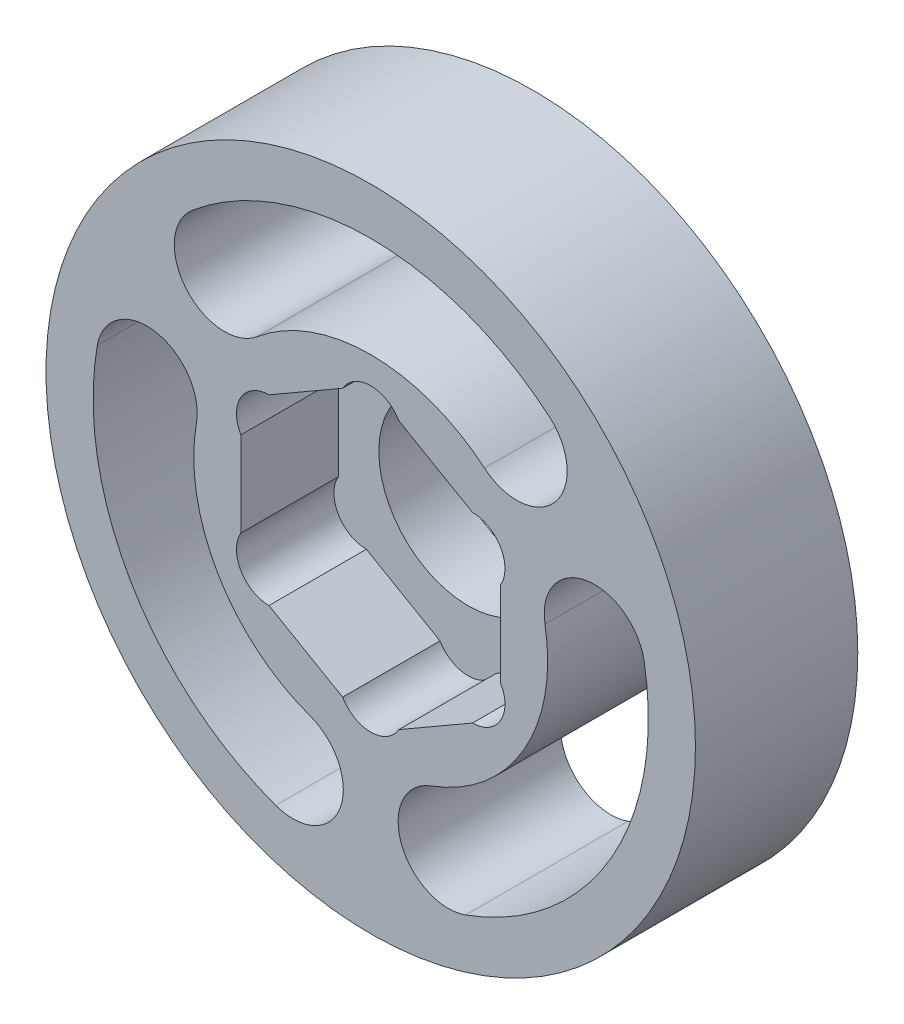
ISO-10303-21;
HEADER;
FILE_DESCRIPTION(('STEP AP214'),'2;1');
FILE_NAME('part.step','',(''),(''),'','','');
FILE_SCHEMA(('AUTOMOTIVE_DESIGN { 1 0 10303 214 1 1 1 1 }'));
ENDSEC;
DATA;
#1=APPLICATION_CONTEXT('core data for automotive mechanical design processes');
#2=APPLICATION_PROTOCOL_DEFINITION('international standard','automotive_design',2000,#1);
#3=PRODUCT_CONTEXT('',#1,'mechanical');
#4=PRODUCT('Part','Part','',(#3));
#5=PRODUCT_RELATED_PRODUCT_CATEGORY('part','',(#4));
#6=PRODUCT_DEFINITION_FORMATION('','',#4);
#7=PRODUCT_DEFINITION_CONTEXT('part definition',#1,'design');
#8=PRODUCT_DEFINITION('design','',#6,#7);
#9=PRODUCT_DEFINITION_SHAPE('','',#8);
#10=(LENGTH_UNIT() NAMED_UNIT(*) SI_UNIT(.MILLI.,.METRE.));
#11=(NAMED_UNIT(*) PLANE_ANGLE_UNIT() SI_UNIT($,.RADIAN.));
#12=(NAMED_UNIT(*) SI_UNIT($,.STERADIAN.) SOLID_ANGLE_UNIT());
#13=UNCERTAINTY_MEASURE_WITH_UNIT(LENGTH_MEASURE(1.E-05),#10,'distance_accuracy_value','');
#14=(GEOMETRIC_REPRESENTATION_CONTEXT(3) GLOBAL_UNCERTAINTY_ASSIGNED_CONTEXT((#13)) GLOBAL_UNIT_ASSIGNED_CONTEXT((#10,
#11,#12)) REPRESENTATION_CONTEXT('',''));
#15=CARTESIAN_POINT('',(0.,0.,0.));
#16=DIRECTION('',(0.,0.,1.));
#17=DIRECTION('',(1.,0.,0.));
#18=AXIS2_PLACEMENT_3D('',#15,#16,#17);
#19=CARTESIAN_POINT('',(0.,0.,5.));
#20=DIRECTION('',(0.,0.,-1.));
#21=DIRECTION('',(-1.,0.,0.));
#22=AXIS2_PLACEMENT_3D('',#19,#20,#21);
#23=CYLINDRICAL_SURFACE('',#22,10.);
#24=CARTESIAN_POINT('',(0.,0.,5.));
#25=DIRECTION('',(0.,0.,1.));
#26=DIRECTION('',(1.,0.,0.));
#27=AXIS2_PLACEMENT_3D('',#24,#25,#26);
#28=CIRCLE('',#27,10.);
#29=CARTESIAN_POINT('',(10.,0.,5.));
#30=VERTEX_POINT('',#29);
#31=EDGE_CURVE('E11',#30,#30,#28,.T.);
#32=ORIENTED_EDGE('',*,*,#31,.F.);
#33=EDGE_LOOP('',(#32));
#34=FACE_BOUND('',#33,.T.);
#35=CARTESIAN_POINT('',(0.,0.,0.));
#36=DIRECTION('',(0.,0.,1.));
#37=DIRECTION('',(1.,0.,0.));
#38=AXIS2_PLACEMENT_3D('',#35,#36,#37);
#39=CIRCLE('',#38,10.);
#40=CARTESIAN_POINT('',(10.,0.,0.));
#41=VERTEX_POINT('',#40);
#42=EDGE_CURVE('E42',#41,#41,#39,.T.);
#43=ORIENTED_EDGE('',*,*,#42,.T.);
#44=EDGE_LOOP('',(#43));
#45=FACE_BOUND('',#44,.T.);
#46=ADVANCED_FACE('F34',(#34,#45),#23,.T.);
#47=CARTESIAN_POINT('',(0.,0.,5.));
#48=DIRECTION('',(0.,0.,1.));
#49=DIRECTION('',(1.,0.,0.));
#50=AXIS2_PLACEMENT_3D('',#47,#48,#49);
#51=PLANE('',#50);
#52=CARTESIAN_POINT('',(-6.89365427108546,1.21553724366852,5.));
#53=DIRECTION('',(0.,0.,1.));
#54=DIRECTION('',(1.,0.,0.));
#55=AXIS2_PLACEMENT_3D('',#52,#53,#54);
#56=CIRCLE('',#55,1.55);
#57=CARTESIAN_POINT('',(-5.36720225391653,0.946382568284777,5.));
#58=VERTEX_POINT('',#57);
#59=CARTESIAN_POINT('',(-8.42010628825438,1.48469191905226,5.));
#60=VERTEX_POINT('',#59);
#61=EDGE_CURVE('E50',#58,#60,#56,.T.);
#62=ORIENTED_EDGE('',*,*,#61,.F.);
#63=CARTESIAN_POINT('',(0.,0.,5.));
#64=DIRECTION('',(0.,0.,-1.));
#65=DIRECTION('',(1.,0.,0.));
#66=AXIS2_PLACEMENT_3D('',#63,#64,#65);
#67=CIRCLE('',#66,5.45);
#68=CARTESIAN_POINT('',(-1.86400978112489,-5.1213247832832,5.));
#69=VERTEX_POINT('',#68);
#70=EDGE_CURVE('E214',#69,#58,#67,.T.);
#71=ORIENTED_EDGE('',*,*,#70,.F.);
#72=CARTESIAN_POINT('',(-2.39414100327968,-6.57784834550136,5.));
#73=DIRECTION('',(0.,0.,1.));
#74=DIRECTION('',(1.,0.,0.));
#75=AXIS2_PLACEMENT_3D('',#72,#73,#74);
#76=CIRCLE('',#75,1.55);
#77=CARTESIAN_POINT('',(-2.92427222543447,-8.03437190771952,5.));
#78=VERTEX_POINT('',#77);
#79=EDGE_CURVE('E217',#78,#69,#76,.T.);
#80=ORIENTED_EDGE('',*,*,#79,.F.);
#81=CARTESIAN_POINT('',(0.,0.,5.));
#82=DIRECTION('',(0.,0.,1.));
#83=DIRECTION('',(1.,0.,0.));
#84=AXIS2_PLACEMENT_3D('',#81,#82,#83);
#85=CIRCLE('',#84,8.55);
#86=EDGE_CURVE('E225',#60,#78,#85,.T.);
#87=ORIENTED_EDGE('',*,*,#86,.F.);
#88=EDGE_LOOP('',(#62,#71,#80,#87));
#89=FACE_BOUND('',#88,.T.);
#90=CARTESIAN_POINT('',(2.39414100327968,-6.57784834550136,5.));
#91=DIRECTION('',(0.,0.,1.));
#92=DIRECTION('',(1.,0.,0.));
#93=AXIS2_PLACEMENT_3D('',#90,#91,#92);
#94=CIRCLE('',#93,1.55);
#95=CARTESIAN_POINT('',(1.86400978112489,-5.1213247832832,5.));
#96=VERTEX_POINT('',#95);
#97=CARTESIAN_POINT('',(2.92427222543446,-8.03437190771952,5.));
#98=VERTEX_POINT('',#97);
#99=EDGE_CURVE('E231',#96,#98,#94,.T.);
#100=ORIENTED_EDGE('',*,*,#99,.F.);
#101=CARTESIAN_POINT('',(0.,0.,5.));
#102=DIRECTION('',(0.,0.,-1.));
#103=DIRECTION('',(1.,0.,0.));
#104=AXIS2_PLACEMENT_3D('',#101,#102,#103);
#105=CIRCLE('',#104,5.45);
#106=CARTESIAN_POINT('',(5.36720225391653,0.946382568284774,5.));
#107=VERTEX_POINT('',#106);
#108=EDGE_CURVE('E239',#107,#96,#105,.T.);
#109=ORIENTED_EDGE('',*,*,#108,.F.);
#110=CARTESIAN_POINT('',(6.89365427108546,1.21553724366852,5.));
#111=DIRECTION('',(0.,0.,1.));
#112=DIRECTION('',(1.,0.,0.));
#113=AXIS2_PLACEMENT_3D('',#110,#111,#112);
#114=CIRCLE('',#113,1.55);
#115=CARTESIAN_POINT('',(8.42010628825438,1.48469191905226,5.));
#116=VERTEX_POINT('',#115);
#117=EDGE_CURVE('E253',#116,#107,#114,.T.);
#118=ORIENTED_EDGE('',*,*,#117,.F.);
#119=CARTESIAN_POINT('',(0.,0.,5.));
#120=DIRECTION('',(0.,0.,1.));
#121=DIRECTION('',(1.,0.,0.));
#122=AXIS2_PLACEMENT_3D('',#119,#120,#121);
#123=CIRCLE('',#122,8.55);
#124=EDGE_CURVE('E250',#98,#116,#123,.T.);
#125=ORIENTED_EDGE('',*,*,#124,.F.);
#126=EDGE_LOOP('',(#100,#109,#118,#125));
#127=FACE_BOUND('',#126,.T.);
#128=CARTESIAN_POINT('',(4.49951326780578,5.36231110183284,5.));
#129=DIRECTION('',(0.,0.,1.));
#130=DIRECTION('',(1.,0.,0.));
#131=AXIS2_PLACEMENT_3D('',#128,#129,#130);
#132=CIRCLE('',#131,1.55);
#133=CARTESIAN_POINT('',(3.50319247279164,4.17494221499843,5.));
#134=VERTEX_POINT('',#133);
#135=CARTESIAN_POINT('',(5.49583406281991,6.54967998866726,5.));
#136=VERTEX_POINT('',#135);
#137=EDGE_CURVE('E260',#134,#136,#132,.T.);
#138=ORIENTED_EDGE('',*,*,#137,.F.);
#139=CARTESIAN_POINT('',(0.,0.,5.));
#140=DIRECTION('',(0.,0.,-1.));
#141=DIRECTION('',(1.,0.,0.));
#142=AXIS2_PLACEMENT_3D('',#139,#140,#141);
#143=CIRCLE('',#142,5.45);
#144=CARTESIAN_POINT('',(-3.50319247279164,4.17494221499843,5.));
#145=VERTEX_POINT('',#144);
#146=EDGE_CURVE('E271',#145,#134,#143,.T.);
#147=ORIENTED_EDGE('',*,*,#146,.F.);
#148=CARTESIAN_POINT('',(-4.49951326780578,5.36231110183284,5.));
#149=DIRECTION('',(0.,0.,1.));
#150=DIRECTION('',(1.,0.,0.));
#151=AXIS2_PLACEMENT_3D('',#148,#149,#150);
#152=CIRCLE('',#151,1.55);
#153=CARTESIAN_POINT('',(-5.49583406281991,6.54967998866726,5.));
#154=VERTEX_POINT('',#153);
#155=EDGE_CURVE('E285',#154,#145,#152,.T.);
#156=ORIENTED_EDGE('',*,*,#155,.F.);
#157=CARTESIAN_POINT('',(0.,0.,5.));
#158=DIRECTION('',(0.,0.,1.));
#159=DIRECTION('',(1.,0.,0.));
#160=AXIS2_PLACEMENT_3D('',#157,#158,#159);
#161=CIRCLE('',#160,8.55);
#162=EDGE_CURVE('E282',#136,#154,#161,.T.);
#163=ORIENTED_EDGE('',*,*,#162,.F.);
#164=EDGE_LOOP('',(#138,#147,#156,#163));
#165=FACE_BOUND('',#164,.T.);
#166=CARTESIAN_POINT('',(-3.13397459621546,1.80940107675832,5.));
#167=DIRECTION('',(0.,0.,1.));
#168=DIRECTION('',(1.,0.,0.));
#169=AXIS2_PLACEMENT_3D('',#166,#167,#168);
#170=CIRCLE('',#169,1.00000000000019);
#171=CARTESIAN_POINT('',(-3.13397459621554,2.80940107675852,5.));
#172=VERTEX_POINT('',#171);
#173=CARTESIAN_POINT('',(-4.,1.30940107675811,5.));
#174=VERTEX_POINT('',#173);
#175=EDGE_CURVE('E292',#172,#174,#170,.T.);
#176=ORIENTED_EDGE('',*,*,#175,.F.);
#177=DIRECTION('',(-0.866025403784439,-0.5,0.));
#178=VECTOR('',#177,1.);
#179=CARTESIAN_POINT('',(0.,4.61880215351701,5.));
#180=LINE('',#179,#178);
#181=CARTESIAN_POINT('',(-0.866025403784438,4.11880215351701,5.));
#182=VERTEX_POINT('',#181);
#183=EDGE_CURVE('E379',#182,#172,#180,.T.);
#184=ORIENTED_EDGE('',*,*,#183,.F.);
#185=CARTESIAN_POINT('',(0.,3.61880215351701,5.));
#186=DIRECTION('',(0.,0.,1.));
#187=DIRECTION('',(1.,0.,0.));
#188=AXIS2_PLACEMENT_3D('',#185,#186,#187);
#189=CIRCLE('',#188,1.);
#190=CARTESIAN_POINT('',(0.866025403784439,4.11880215351701,5.));
#191=VERTEX_POINT('',#190);
#192=EDGE_CURVE('E353',#191,#182,#189,.T.);
#193=ORIENTED_EDGE('',*,*,#192,.F.);
#194=DIRECTION('',(-0.866025403784439,0.5,0.));
#195=VECTOR('',#194,1.);
#196=CARTESIAN_POINT('',(4.,2.30940107675851,5.));
#197=LINE('',#196,#195);
#198=CARTESIAN_POINT('',(3.13397459621516,2.80940107675874,5.));
#199=VERTEX_POINT('',#198);
#200=EDGE_CURVE('E363',#199,#191,#197,.T.);
#201=ORIENTED_EDGE('',*,*,#200,.F.);
#202=CARTESIAN_POINT('',(3.13397459621566,1.80940107675868,5.));
#203=DIRECTION('',(0.,0.,1.));
#204=DIRECTION('',(1.,0.,0.));
#205=AXIS2_PLACEMENT_3D('',#202,#203,#204);
#206=CIRCLE('',#205,1.00000000000006);
#207=CARTESIAN_POINT('',(4.,1.30940107675839,5.));
#208=VERTEX_POINT('',#207);
#209=EDGE_CURVE('E342',#208,#199,#206,.T.);
#210=ORIENTED_EDGE('',*,*,#209,.F.);
#211=DIRECTION('',(0.,1.,0.));
#212=VECTOR('',#211,1.);
#213=CARTESIAN_POINT('',(4.,-2.30940107675851,5.));
#214=LINE('',#213,#212);
#215=CARTESIAN_POINT('',(4.,-1.30940107675727,5.));
#216=VERTEX_POINT('',#215);
#217=EDGE_CURVE('E367',#216,#208,#214,.T.);
#218=ORIENTED_EDGE('',*,*,#217,.F.);
#219=CARTESIAN_POINT('',(3.13397459621587,-1.80940107675833,5.));
#220=DIRECTION('',(0.,0.,1.));
#221=DIRECTION('',(1.,0.,0.));
#222=AXIS2_PLACEMENT_3D('',#219,#220,#221);
#223=CIRCLE('',#222,1.00000000000026);
#224=CARTESIAN_POINT('',(3.13397459621542,-2.80940107675859,5.));
#225=VERTEX_POINT('',#224);
#226=EDGE_CURVE('E331',#225,#216,#223,.T.);
#227=ORIENTED_EDGE('',*,*,#226,.F.);
#228=DIRECTION('',(0.866025403784439,0.5,0.));
#229=VECTOR('',#228,1.);
#230=CARTESIAN_POINT('',(0.,-4.61880215351701,5.));
#231=LINE('',#230,#229);
#232=CARTESIAN_POINT('',(0.866025403785778,-4.11880215351623,5.));
#233=VERTEX_POINT('',#232);
#234=EDGE_CURVE('E386',#233,#225,#231,.T.);
#235=ORIENTED_EDGE('',*,*,#234,.F.);
#236=CARTESIAN_POINT('',(4.10523822278712E-13,-3.61880215351701,5.));
#237=DIRECTION('',(0.,0.,1.));
#238=DIRECTION('',(1.,0.,0.));
#239=AXIS2_PLACEMENT_3D('',#236,#237,#238);
#240=CIRCLE('',#239,1.00000000000042);
#241=CARTESIAN_POINT('',(-0.866025403784544,-4.11880215351695,5.));
#242=VERTEX_POINT('',#241);
#243=EDGE_CURVE('E320',#242,#233,#240,.T.);
#244=ORIENTED_EDGE('',*,*,#243,.F.);
#245=DIRECTION('',(0.866025403784438,-0.5,0.));
#246=VECTOR('',#245,1.);
#247=CARTESIAN_POINT('',(-4.,-2.3094010767585,5.));
#248=LINE('',#247,#246);
#249=CARTESIAN_POINT('',(-3.1339745962146,-2.80940107675906,5.));
#250=VERTEX_POINT('',#249);
#251=EDGE_CURVE('E384',#250,#242,#248,.T.);
#252=ORIENTED_EDGE('',*,*,#251,.F.);
#253=CARTESIAN_POINT('',(-3.13397459621525,-1.80940107675868,5.));
#254=DIRECTION('',(0.,0.,1.));
#255=DIRECTION('',(1.,0.,0.));
#256=AXIS2_PLACEMENT_3D('',#253,#254,#255);
#257=CIRCLE('',#256,1.00000000000038);
#258=CARTESIAN_POINT('',(-4.,-1.30940107675846,5.));
#259=VERTEX_POINT('',#258);
#260=EDGE_CURVE('E309',#259,#250,#257,.T.);
#261=ORIENTED_EDGE('',*,*,#260,.F.);
#262=DIRECTION('',(0.,-1.,0.));
#263=VECTOR('',#262,1.);
#264=CARTESIAN_POINT('',(-4.,2.3094010767585,5.));
#265=LINE('',#264,#263);
#266=EDGE_CURVE('E382',#174,#259,#265,.T.);
#267=ORIENTED_EDGE('',*,*,#266,.F.);
#268=EDGE_LOOP('',(#176,#184,#193,#201,#210,#218,#227,#235,#244,#252,#261,#267));
#269=FACE_BOUND('',#268,.T.);
#270=ORIENTED_EDGE('',*,*,#31,.T.);
#271=EDGE_LOOP('',(#270));
#272=FACE_BOUND('',#271,.T.);
#273=ADVANCED_FACE('F394',(#89,#127,#165,#269,#272),#51,.T.);
#274=CARTESIAN_POINT('',(0.,0.,0.));
#275=DIRECTION('',(0.,0.,1.));
#276=DIRECTION('',(1.,0.,0.));
#277=AXIS2_PLACEMENT_3D('',#274,#275,#276);
#278=PLANE('',#277);
#279=CARTESIAN_POINT('',(0.,0.,0.));
#280=DIRECTION('',(0.,0.,-1.));
#281=DIRECTION('',(-1.,0.,0.));
#282=AXIS2_PLACEMENT_3D('',#279,#280,#281);
#283=CIRCLE('',#282,2.75);
#284=CARTESIAN_POINT('',(-2.75,0.,0.));
#285=VERTEX_POINT('',#284);
#286=EDGE_CURVE('E220',#285,#285,#283,.T.);
#287=ORIENTED_EDGE('',*,*,#286,.F.);
#288=EDGE_LOOP('',(#287));
#289=FACE_BOUND('',#288,.T.);
#290=CARTESIAN_POINT('',(0.,0.,0.));
#291=DIRECTION('',(0.,0.,-1.));
#292=DIRECTION('',(1.,0.,0.));
#293=AXIS2_PLACEMENT_3D('',#290,#291,#292);
#294=CIRCLE('',#293,5.45);
#295=CARTESIAN_POINT('',(-1.86400978112489,-5.1213247832832,0.));
#296=VERTEX_POINT('',#295);
#297=CARTESIAN_POINT('',(-5.36720225391653,0.946382568284777,0.));
#298=VERTEX_POINT('',#297);
#299=EDGE_CURVE('E204',#296,#298,#294,.T.);
#300=ORIENTED_EDGE('',*,*,#299,.T.);
#301=CARTESIAN_POINT('',(-6.89365427108546,1.21553724366852,0.));
#302=DIRECTION('',(0.,0.,1.));
#303=DIRECTION('',(1.,0.,0.));
#304=AXIS2_PLACEMENT_3D('',#301,#302,#303);
#305=CIRCLE('',#304,1.55);
#306=CARTESIAN_POINT('',(-8.42010628825438,1.48469191905226,0.));
#307=VERTEX_POINT('',#306);
#308=EDGE_CURVE('E198',#298,#307,#305,.T.);
#309=ORIENTED_EDGE('',*,*,#308,.T.);
#310=CARTESIAN_POINT('',(0.,0.,0.));
#311=DIRECTION('',(0.,0.,1.));
#312=DIRECTION('',(1.,0.,0.));
#313=AXIS2_PLACEMENT_3D('',#310,#311,#312);
#314=CIRCLE('',#313,8.55);
#315=CARTESIAN_POINT('',(-2.92427222543447,-8.03437190771952,0.));
#316=VERTEX_POINT('',#315);
#317=EDGE_CURVE('E207',#307,#316,#314,.T.);
#318=ORIENTED_EDGE('',*,*,#317,.T.);
#319=CARTESIAN_POINT('',(-2.39414100327968,-6.57784834550136,0.));
#320=DIRECTION('',(0.,0.,1.));
#321=DIRECTION('',(1.,0.,0.));
#322=AXIS2_PLACEMENT_3D('',#319,#320,#321);
#323=CIRCLE('',#322,1.55);
#324=EDGE_CURVE('E58',#316,#296,#323,.T.);
#325=ORIENTED_EDGE('',*,*,#324,.T.);
#326=EDGE_LOOP('',(#300,#309,#318,#325));
#327=FACE_BOUND('',#326,.T.);
#328=CARTESIAN_POINT('',(0.,0.,0.));
#329=DIRECTION('',(0.,0.,-1.));
#330=DIRECTION('',(1.,0.,0.));
#331=AXIS2_PLACEMENT_3D('',#328,#329,#330);
#332=CIRCLE('',#331,5.45);
#333=CARTESIAN_POINT('',(5.36720225391653,0.946382568284774,0.));
#334=VERTEX_POINT('',#333);
#335=CARTESIAN_POINT('',(1.86400978112489,-5.1213247832832,0.));
#336=VERTEX_POINT('',#335);
#337=EDGE_CURVE('E245',#334,#336,#332,.T.);
#338=ORIENTED_EDGE('',*,*,#337,.T.);
#339=CARTESIAN_POINT('',(2.39414100327968,-6.57784834550136,0.));
#340=DIRECTION('',(0.,0.,1.));
#341=DIRECTION('',(1.,0.,0.));
#342=AXIS2_PLACEMENT_3D('',#339,#340,#341);
#343=CIRCLE('',#342,1.55);
#344=CARTESIAN_POINT('',(2.92427222543446,-8.03437190771952,0.));
#345=VERTEX_POINT('',#344);
#346=EDGE_CURVE('E235',#336,#345,#343,.T.);
#347=ORIENTED_EDGE('',*,*,#346,.T.);
#348=CARTESIAN_POINT('',(0.,0.,0.));
#349=DIRECTION('',(0.,0.,1.));
#350=DIRECTION('',(1.,0.,0.));
#351=AXIS2_PLACEMENT_3D('',#348,#349,#350);
#352=CIRCLE('',#351,8.55);
#353=CARTESIAN_POINT('',(8.42010628825438,1.48469191905226,0.));
#354=VERTEX_POINT('',#353);
#355=EDGE_CURVE('E238',#345,#354,#352,.T.);
#356=ORIENTED_EDGE('',*,*,#355,.T.);
#357=CARTESIAN_POINT('',(6.89365427108546,1.21553724366852,0.));
#358=DIRECTION('',(0.,0.,1.));
#359=DIRECTION('',(1.,0.,0.));
#360=AXIS2_PLACEMENT_3D('',#357,#358,#359);
#361=CIRCLE('',#360,1.55);
#362=EDGE_CURVE('E242',#354,#334,#361,.T.);
#363=ORIENTED_EDGE('',*,*,#362,.T.);
#364=EDGE_LOOP('',(#338,#347,#356,#363));
#365=FACE_BOUND('',#364,.T.);
#366=CARTESIAN_POINT('',(0.,0.,0.));
#367=DIRECTION('',(0.,0.,-1.));
#368=DIRECTION('',(1.,0.,0.));
#369=AXIS2_PLACEMENT_3D('',#366,#367,#368);
#370=CIRCLE('',#369,5.45);
#371=CARTESIAN_POINT('',(-3.50319247279164,4.17494221499843,0.));
#372=VERTEX_POINT('',#371);
#373=CARTESIAN_POINT('',(3.50319247279164,4.17494221499843,0.));
#374=VERTEX_POINT('',#373);
#375=EDGE_CURVE('E277',#372,#374,#370,.T.);
#376=ORIENTED_EDGE('',*,*,#375,.T.);
#377=CARTESIAN_POINT('',(4.49951326780578,5.36231110183284,0.));
#378=DIRECTION('',(0.,0.,1.));
#379=DIRECTION('',(1.,0.,0.));
#380=AXIS2_PLACEMENT_3D('',#377,#378,#379);
#381=CIRCLE('',#380,1.55);
#382=CARTESIAN_POINT('',(5.49583406281991,6.54967998866726,0.));
#383=VERTEX_POINT('',#382);
#384=EDGE_CURVE('E267',#374,#383,#381,.T.);
#385=ORIENTED_EDGE('',*,*,#384,.T.);
#386=CARTESIAN_POINT('',(0.,0.,0.));
#387=DIRECTION('',(0.,0.,1.));
#388=DIRECTION('',(1.,0.,0.));
#389=AXIS2_PLACEMENT_3D('',#386,#387,#388);
#390=CIRCLE('',#389,8.55);
#391=CARTESIAN_POINT('',(-5.49583406281991,6.54967998866726,0.));
#392=VERTEX_POINT('',#391);
#393=EDGE_CURVE('E270',#383,#392,#390,.T.);
#394=ORIENTED_EDGE('',*,*,#393,.T.);
#395=CARTESIAN_POINT('',(-4.49951326780578,5.36231110183284,0.));
#396=DIRECTION('',(0.,0.,1.));
#397=DIRECTION('',(1.,0.,0.));
#398=AXIS2_PLACEMENT_3D('',#395,#396,#397);
#399=CIRCLE('',#398,1.55);
#400=EDGE_CURVE('E274',#392,#372,#399,.T.);
#401=ORIENTED_EDGE('',*,*,#400,.T.);
#402=EDGE_LOOP('',(#376,#385,#394,#401));
#403=FACE_BOUND('',#402,.T.);
#404=ORIENTED_EDGE('',*,*,#42,.F.);
#405=EDGE_LOOP('',(#404));
#406=FACE_BOUND('',#405,.T.);
#407=ADVANCED_FACE('F211',(#289,#327,#365,#403,#406),#278,.F.);
#408=CARTESIAN_POINT('',(4.,2.30940107675851,2.));
#409=DIRECTION('',(0.5,0.866025403784438,0.));
#410=DIRECTION('',(-0.866025403784439,0.5,0.));
#411=AXIS2_PLACEMENT_3D('',#408,#409,#410);
#412=PLANE('',#411);
#413=DIRECTION('',(-0.866025403784439,0.5,0.));
#414=VECTOR('',#413,1.);
#415=CARTESIAN_POINT('',(4.,2.30940107675851,2.));
#416=LINE('',#415,#414);
#417=CARTESIAN_POINT('',(3.13397459621516,2.80940107675874,2.));
#418=VERTEX_POINT('',#417);
#419=CARTESIAN_POINT('',(0.866025403784439,4.11880215351701,2.));
#420=VERTEX_POINT('',#419);
#421=EDGE_CURVE('E364',#418,#420,#416,.T.);
#422=ORIENTED_EDGE('',*,*,#421,.F.);
#423=DIRECTION('',(0.,0.,1.));
#424=VECTOR('',#423,1.);
#425=CARTESIAN_POINT('',(3.13397459621515,2.80940107675874,2.));
#426=LINE('',#425,#424);
#427=EDGE_CURVE('E350',#418,#199,#426,.T.);
#428=ORIENTED_EDGE('',*,*,#427,.T.);
#429=ORIENTED_EDGE('',*,*,#200,.T.);
#430=DIRECTION('',(0.,0.,1.));
#431=VECTOR('',#430,1.);
#432=CARTESIAN_POINT('',(0.866025403784439,4.11880215351701,2.));
#433=LINE('',#432,#431);
#434=EDGE_CURVE('E360',#191,#420,#433,.F.);
#435=ORIENTED_EDGE('',*,*,#434,.T.);
#436=EDGE_LOOP('',(#422,#428,#429,#435));
#437=FACE_BOUND('',#436,.T.);
#438=ADVANCED_FACE('F393',(#437),#412,.F.);
#439=CARTESIAN_POINT('',(4.,-2.30940107675851,2.));
#440=DIRECTION('',(1.,0.,0.));
#441=DIRECTION('',(0.,1.,0.));
#442=AXIS2_PLACEMENT_3D('',#439,#440,#441);
#443=PLANE('',#442);
#444=DIRECTION('',(0.,1.,0.));
#445=VECTOR('',#444,1.);
#446=CARTESIAN_POINT('',(4.,-2.30940107675851,2.));
#447=LINE('',#446,#445);
#448=CARTESIAN_POINT('',(4.,-1.30940107675727,2.));
#449=VERTEX_POINT('',#448);
#450=CARTESIAN_POINT('',(4.,1.30940107675839,2.));
#451=VERTEX_POINT('',#450);
#452=EDGE_CURVE('E376',#449,#451,#447,.T.);
#453=ORIENTED_EDGE('',*,*,#452,.F.);
#454=DIRECTION('',(0.,0.,1.));
#455=VECTOR('',#454,1.);
#456=CARTESIAN_POINT('',(4.,-1.30940107675727,2.));
#457=LINE('',#456,#455);
#458=EDGE_CURVE('E339',#449,#216,#457,.T.);
#459=ORIENTED_EDGE('',*,*,#458,.T.);
#460=ORIENTED_EDGE('',*,*,#217,.T.);
#461=DIRECTION('',(0.,0.,1.));
#462=VECTOR('',#461,1.);
#463=CARTESIAN_POINT('',(4.,1.30940107675839,2.));
#464=LINE('',#463,#462);
#465=EDGE_CURVE('E346',#208,#451,#464,.F.);
#466=ORIENTED_EDGE('',*,*,#465,.T.);
#467=EDGE_LOOP('',(#453,#459,#460,#466));
#468=FACE_BOUND('',#467,.T.);
#469=ADVANCED_FACE('F400',(#468),#443,.F.);
#470=CARTESIAN_POINT('',(0.,-4.61880215351701,2.));
#471=DIRECTION('',(0.5,-0.866025403784439,0.));
#472=DIRECTION('',(0.866025403784439,0.5,0.));
#473=AXIS2_PLACEMENT_3D('',#470,#471,#472);
#474=PLANE('',#473);
#475=DIRECTION('',(0.866025403784439,0.5,0.));
#476=VECTOR('',#475,1.);
#477=CARTESIAN_POINT('',(0.,-4.61880215351701,2.));
#478=LINE('',#477,#476);
#479=CARTESIAN_POINT('',(0.866025403785778,-4.11880215351623,2.));
#480=VERTEX_POINT('',#479);
#481=CARTESIAN_POINT('',(3.13397459621542,-2.80940107675859,2.));
#482=VERTEX_POINT('',#481);
#483=EDGE_CURVE('E374',#480,#482,#478,.T.);
#484=ORIENTED_EDGE('',*,*,#483,.F.);
#485=DIRECTION('',(0.,0.,1.));
#486=VECTOR('',#485,1.);
#487=CARTESIAN_POINT('',(0.866025403785777,-4.11880215351623,2.));
#488=LINE('',#487,#486);
#489=EDGE_CURVE('E328',#480,#233,#488,.T.);
#490=ORIENTED_EDGE('',*,*,#489,.T.);
#491=ORIENTED_EDGE('',*,*,#234,.T.);
#492=DIRECTION('',(0.,0.,1.));
#493=VECTOR('',#492,1.);
#494=CARTESIAN_POINT('',(3.13397459621542,-2.80940107675859,2.));
#495=LINE('',#494,#493);
#496=EDGE_CURVE('E335',#225,#482,#495,.F.);
#497=ORIENTED_EDGE('',*,*,#496,.T.);
#498=EDGE_LOOP('',(#484,#490,#491,#497));
#499=FACE_BOUND('',#498,.T.);
#500=ADVANCED_FACE('F598',(#499),#474,.F.);
#501=CARTESIAN_POINT('',(-4.,-2.3094010767585,2.));
#502=DIRECTION('',(-0.5,-0.866025403784439,0.));
#503=DIRECTION('',(0.866025403784439,-0.5,0.));
#504=AXIS2_PLACEMENT_3D('',#501,#502,#503);
#505=PLANE('',#504);
#506=DIRECTION('',(0.866025403784438,-0.5,0.));
#507=VECTOR('',#506,1.);
#508=CARTESIAN_POINT('',(-4.,-2.3094010767585,2.));
#509=LINE('',#508,#507);
#510=CARTESIAN_POINT('',(-3.13397459621459,-2.80940107675906,2.));
#511=VERTEX_POINT('',#510);
#512=CARTESIAN_POINT('',(-0.866025403784544,-4.11880215351695,2.));
#513=VERTEX_POINT('',#512);
#514=EDGE_CURVE('E372',#511,#513,#509,.T.);
#515=ORIENTED_EDGE('',*,*,#514,.F.);
#516=DIRECTION('',(0.,0.,1.));
#517=VECTOR('',#516,1.);
#518=CARTESIAN_POINT('',(-3.1339745962146,-2.80940107675906,2.));
#519=LINE('',#518,#517);
#520=EDGE_CURVE('E317',#511,#250,#519,.T.);
#521=ORIENTED_EDGE('',*,*,#520,.T.);
#522=ORIENTED_EDGE('',*,*,#251,.T.);
#523=DIRECTION('',(0.,0.,1.));
#524=VECTOR('',#523,1.);
#525=CARTESIAN_POINT('',(-0.866025403784544,-4.11880215351695,2.));
#526=LINE('',#525,#524);
#527=EDGE_CURVE('E324',#242,#513,#526,.F.);
#528=ORIENTED_EDGE('',*,*,#527,.T.);
#529=EDGE_LOOP('',(#515,#521,#522,#528));
#530=FACE_BOUND('',#529,.T.);
#531=ADVANCED_FACE('F602',(#530),#505,.F.);
#532=CARTESIAN_POINT('',(-4.,2.3094010767585,2.));
#533=DIRECTION('',(-1.,0.,0.));
#534=DIRECTION('',(0.,0.,1.));
#535=AXIS2_PLACEMENT_3D('',#532,#533,#534);
#536=PLANE('',#535);
#537=DIRECTION('',(0.,-1.,0.));
#538=VECTOR('',#537,1.);
#539=CARTESIAN_POINT('',(-4.,2.3094010767585,2.));
#540=LINE('',#539,#538);
#541=CARTESIAN_POINT('',(-4.,1.30940107675811,2.));
#542=VERTEX_POINT('',#541);
#543=CARTESIAN_POINT('',(-4.,-1.30940107675846,2.));
#544=VERTEX_POINT('',#543);
#545=EDGE_CURVE('E370',#542,#544,#540,.T.);
#546=ORIENTED_EDGE('',*,*,#545,.F.);
#547=DIRECTION('',(0.,0.,1.));
#548=VECTOR('',#547,1.);
#549=CARTESIAN_POINT('',(-4.,1.30940107675811,2.));
#550=LINE('',#549,#548);
#551=EDGE_CURVE('E306',#542,#174,#550,.T.);
#552=ORIENTED_EDGE('',*,*,#551,.T.);
#553=ORIENTED_EDGE('',*,*,#266,.T.);
#554=DIRECTION('',(0.,0.,1.));
#555=VECTOR('',#554,1.);
#556=CARTESIAN_POINT('',(-4.,-1.30940107675846,2.));
#557=LINE('',#556,#555);
#558=EDGE_CURVE('E313',#259,#544,#557,.F.);
#559=ORIENTED_EDGE('',*,*,#558,.T.);
#560=EDGE_LOOP('',(#546,#552,#553,#559));
#561=FACE_BOUND('',#560,.T.);
#562=ADVANCED_FACE('F606',(#561),#536,.F.);
#563=CARTESIAN_POINT('',(0.,4.61880215351701,2.));
#564=DIRECTION('',(-0.5,0.866025403784439,0.));
#565=DIRECTION('',(-0.866025403784439,-0.5,0.));
#566=AXIS2_PLACEMENT_3D('',#563,#564,#565);
#567=PLANE('',#566);
#568=ORIENTED_EDGE('',*,*,#183,.T.);
#569=DIRECTION('',(0.,0.,1.));
#570=VECTOR('',#569,1.);
#571=CARTESIAN_POINT('',(-3.13397459621554,2.80940107675852,2.));
#572=LINE('',#571,#570);
#573=CARTESIAN_POINT('',(-3.13397459621554,2.80940107675852,2.));
#574=VERTEX_POINT('',#573);
#575=EDGE_CURVE('E302',#172,#574,#572,.F.);
#576=ORIENTED_EDGE('',*,*,#575,.T.);
#577=DIRECTION('',(-0.866025403784439,-0.5,0.));
#578=VECTOR('',#577,1.);
#579=CARTESIAN_POINT('',(0.,4.61880215351701,2.));
#580=LINE('',#579,#578);
#581=CARTESIAN_POINT('',(-0.866025403784438,4.11880215351701,2.));
#582=VERTEX_POINT('',#581);
#583=EDGE_CURVE('E366',#582,#574,#580,.T.);
#584=ORIENTED_EDGE('',*,*,#583,.F.);
#585=DIRECTION('',(0.,0.,1.));
#586=VECTOR('',#585,1.);
#587=CARTESIAN_POINT('',(-0.866025403784439,4.11880215351701,2.));
#588=LINE('',#587,#586);
#589=EDGE_CURVE('E356',#582,#182,#588,.T.);
#590=ORIENTED_EDGE('',*,*,#589,.T.);
#591=EDGE_LOOP('',(#568,#576,#584,#590));
#592=FACE_BOUND('',#591,.T.);
#593=ADVANCED_FACE('F557',(#592),#567,.F.);
#594=CARTESIAN_POINT('',(0.,0.,2.));
#595=DIRECTION('',(0.,0.,1.));
#596=DIRECTION('',(1.,0.,0.));
#597=AXIS2_PLACEMENT_3D('',#594,#595,#596);
#598=PLANE('',#597);
#599=CARTESIAN_POINT('',(0.,0.,2.));
#600=DIRECTION('',(0.,0.,1.));
#601=DIRECTION('',(1.,0.,0.));
#602=AXIS2_PLACEMENT_3D('',#599,#600,#601);
#603=CIRCLE('',#602,2.75);
#604=CARTESIAN_POINT('',(2.75,0.,2.));
#605=VERTEX_POINT('',#604);
#606=EDGE_CURVE('E37',#605,#605,#603,.T.);
#607=ORIENTED_EDGE('',*,*,#606,.F.);
#608=EDGE_LOOP('',(#607));
#609=FACE_BOUND('',#608,.T.);
#610=ORIENTED_EDGE('',*,*,#583,.T.);
#611=CARTESIAN_POINT('',(-3.13397459621546,1.80940107675832,2.));
#612=DIRECTION('',(0.,0.,1.));
#613=DIRECTION('',(1.,0.,0.));
#614=AXIS2_PLACEMENT_3D('',#611,#612,#613);
#615=CIRCLE('',#614,1.00000000000019);
#616=EDGE_CURVE('E299',#574,#542,#615,.T.);
#617=ORIENTED_EDGE('',*,*,#616,.T.);
#618=ORIENTED_EDGE('',*,*,#545,.T.);
#619=CARTESIAN_POINT('',(-3.13397459621525,-1.80940107675868,2.));
#620=DIRECTION('',(0.,0.,1.));
#621=DIRECTION('',(1.,0.,0.));
#622=AXIS2_PLACEMENT_3D('',#619,#620,#621);
#623=CIRCLE('',#622,1.00000000000038);
#624=EDGE_CURVE('E310',#544,#511,#623,.T.);
#625=ORIENTED_EDGE('',*,*,#624,.T.);
#626=ORIENTED_EDGE('',*,*,#514,.T.);
#627=CARTESIAN_POINT('',(4.10523822278712E-13,-3.61880215351701,2.));
#628=DIRECTION('',(0.,0.,1.));
#629=DIRECTION('',(1.,0.,0.));
#630=AXIS2_PLACEMENT_3D('',#627,#628,#629);
#631=CIRCLE('',#630,1.00000000000042);
#632=EDGE_CURVE('E321',#513,#480,#631,.T.);
#633=ORIENTED_EDGE('',*,*,#632,.T.);
#634=ORIENTED_EDGE('',*,*,#483,.T.);
#635=CARTESIAN_POINT('',(3.13397459621587,-1.80940107675833,2.));
#636=DIRECTION('',(0.,0.,1.));
#637=DIRECTION('',(1.,0.,0.));
#638=AXIS2_PLACEMENT_3D('',#635,#636,#637);
#639=CIRCLE('',#638,1.00000000000026);
#640=EDGE_CURVE('E332',#482,#449,#639,.T.);
#641=ORIENTED_EDGE('',*,*,#640,.T.);
#642=ORIENTED_EDGE('',*,*,#452,.T.);
#643=CARTESIAN_POINT('',(3.13397459621566,1.80940107675868,2.));
#644=DIRECTION('',(0.,0.,1.));
#645=DIRECTION('',(1.,0.,0.));
#646=AXIS2_PLACEMENT_3D('',#643,#644,#645);
#647=CIRCLE('',#646,1.00000000000006);
#648=EDGE_CURVE('E343',#451,#418,#647,.T.);
#649=ORIENTED_EDGE('',*,*,#648,.T.);
#650=ORIENTED_EDGE('',*,*,#421,.T.);
#651=CARTESIAN_POINT('',(0.,3.61880215351701,2.));
#652=DIRECTION('',(0.,0.,1.));
#653=DIRECTION('',(1.,0.,0.));
#654=AXIS2_PLACEMENT_3D('',#651,#652,#653);
#655=CIRCLE('',#654,1.);
#656=EDGE_CURVE('E354',#420,#582,#655,.T.);
#657=ORIENTED_EDGE('',*,*,#656,.T.);
#658=EDGE_LOOP('',(#610,#617,#618,#625,#626,#633,#634,#641,#642,#649,#650,#657));
#659=FACE_BOUND('',#658,.T.);
#660=ADVANCED_FACE('F551',(#609,#659),#598,.T.);
#661=CARTESIAN_POINT('',(0.,3.61880215351701,2.));
#662=DIRECTION('',(0.,0.,1.));
#663=DIRECTION('',(1.,0.,0.));
#664=AXIS2_PLACEMENT_3D('',#661,#662,#663);
#665=CYLINDRICAL_SURFACE('',#664,1.);
#666=ORIENTED_EDGE('',*,*,#192,.T.);
#667=ORIENTED_EDGE('',*,*,#589,.F.);
#668=ORIENTED_EDGE('',*,*,#656,.F.);
#669=ORIENTED_EDGE('',*,*,#434,.F.);
#670=EDGE_LOOP('',(#666,#667,#668,#669));
#671=FACE_BOUND('',#670,.T.);
#672=ADVANCED_FACE('F556',(#671),#665,.F.);
#673=CARTESIAN_POINT('',(3.13397459621566,1.80940107675868,2.));
#674=DIRECTION('',(0.,0.,1.));
#675=DIRECTION('',(1.,0.,0.));
#676=AXIS2_PLACEMENT_3D('',#673,#674,#675);
#677=CYLINDRICAL_SURFACE('',#676,1.00000000000006);
#678=ORIENTED_EDGE('',*,*,#648,.F.);
#679=ORIENTED_EDGE('',*,*,#465,.F.);
#680=ORIENTED_EDGE('',*,*,#209,.T.);
#681=ORIENTED_EDGE('',*,*,#427,.F.);
#682=EDGE_LOOP('',(#678,#679,#680,#681));
#683=FACE_BOUND('',#682,.T.);
#684=ADVANCED_FACE('F589',(#683),#677,.F.);
#685=CARTESIAN_POINT('',(3.13397459621587,-1.80940107675833,2.));
#686=DIRECTION('',(0.,0.,1.));
#687=DIRECTION('',(1.,0.,0.));
#688=AXIS2_PLACEMENT_3D('',#685,#686,#687);
#689=CYLINDRICAL_SURFACE('',#688,1.00000000000026);
#690=ORIENTED_EDGE('',*,*,#640,.F.);
#691=ORIENTED_EDGE('',*,*,#496,.F.);
#692=ORIENTED_EDGE('',*,*,#226,.T.);
#693=ORIENTED_EDGE('',*,*,#458,.F.);
#694=EDGE_LOOP('',(#690,#691,#692,#693));
#695=FACE_BOUND('',#694,.T.);
#696=ADVANCED_FACE('F585',(#695),#689,.F.);
#697=CARTESIAN_POINT('',(4.10523822278712E-13,-3.61880215351701,2.));
#698=DIRECTION('',(0.,0.,1.));
#699=DIRECTION('',(1.,0.,0.));
#700=AXIS2_PLACEMENT_3D('',#697,#698,#699);
#701=CYLINDRICAL_SURFACE('',#700,1.00000000000042);
#702=ORIENTED_EDGE('',*,*,#632,.F.);
#703=ORIENTED_EDGE('',*,*,#527,.F.);
#704=ORIENTED_EDGE('',*,*,#243,.T.);
#705=ORIENTED_EDGE('',*,*,#489,.F.);
#706=EDGE_LOOP('',(#702,#703,#704,#705));
#707=FACE_BOUND('',#706,.T.);
#708=ADVANCED_FACE('F581',(#707),#701,.F.);
#709=CARTESIAN_POINT('',(-3.13397459621525,-1.80940107675868,2.));
#710=DIRECTION('',(0.,0.,1.));
#711=DIRECTION('',(1.,0.,0.));
#712=AXIS2_PLACEMENT_3D('',#709,#710,#711);
#713=CYLINDRICAL_SURFACE('',#712,1.00000000000038);
#714=ORIENTED_EDGE('',*,*,#624,.F.);
#715=ORIENTED_EDGE('',*,*,#558,.F.);
#716=ORIENTED_EDGE('',*,*,#260,.T.);
#717=ORIENTED_EDGE('',*,*,#520,.F.);
#718=EDGE_LOOP('',(#714,#715,#716,#717));
#719=FACE_BOUND('',#718,.T.);
#720=ADVANCED_FACE('F577',(#719),#713,.F.);
#721=CARTESIAN_POINT('',(-3.13397459621546,1.80940107675832,2.));
#722=DIRECTION('',(0.,0.,1.));
#723=DIRECTION('',(1.,0.,0.));
#724=AXIS2_PLACEMENT_3D('',#721,#722,#723);
#725=CYLINDRICAL_SURFACE('',#724,1.00000000000019);
#726=ORIENTED_EDGE('',*,*,#616,.F.);
#727=ORIENTED_EDGE('',*,*,#575,.F.);
#728=ORIENTED_EDGE('',*,*,#175,.T.);
#729=ORIENTED_EDGE('',*,*,#551,.F.);
#730=EDGE_LOOP('',(#726,#727,#728,#729));
#731=FACE_BOUND('',#730,.T.);
#732=ADVANCED_FACE('F424',(#731),#725,.F.);
#733=CARTESIAN_POINT('',(4.49951326780578,5.36231110183284,0.));
#734=DIRECTION('',(0.,0.,1.));
#735=DIRECTION('',(1.,0.,0.));
#736=AXIS2_PLACEMENT_3D('',#733,#734,#735);
#737=CYLINDRICAL_SURFACE('',#736,1.55);
#738=ORIENTED_EDGE('',*,*,#137,.T.);
#739=DIRECTION('',(0.,0.,1.));
#740=VECTOR('',#739,1.);
#741=CARTESIAN_POINT('',(5.49583406281991,6.54967998866726,0.));
#742=LINE('',#741,#740);
#743=EDGE_CURVE('E280',#383,#136,#742,.T.);
#744=ORIENTED_EDGE('',*,*,#743,.F.);
#745=ORIENTED_EDGE('',*,*,#384,.F.);
#746=DIRECTION('',(0.,0.,1.));
#747=VECTOR('',#746,1.);
#748=CARTESIAN_POINT('',(3.50319247279164,4.17494221499843,0.));
#749=LINE('',#748,#747);
#750=EDGE_CURVE('E290',#374,#134,#749,.T.);
#751=ORIENTED_EDGE('',*,*,#750,.T.);
#752=EDGE_LOOP('',(#738,#744,#745,#751));
#753=FACE_BOUND('',#752,.T.);
#754=ADVANCED_FACE('F429',(#753),#737,.F.);
#755=CARTESIAN_POINT('',(0.,0.,0.));
#756=DIRECTION('',(0.,0.,1.));
#757=DIRECTION('',(1.,0.,0.));
#758=AXIS2_PLACEMENT_3D('',#755,#756,#757);
#759=CYLINDRICAL_SURFACE('',#758,5.45);
#760=ORIENTED_EDGE('',*,*,#146,.T.);
#761=ORIENTED_EDGE('',*,*,#750,.F.);
#762=ORIENTED_EDGE('',*,*,#375,.F.);
#763=DIRECTION('',(0.,0.,1.));
#764=VECTOR('',#763,1.);
#765=CARTESIAN_POINT('',(-3.50319247279164,4.17494221499843,0.));
#766=LINE('',#765,#764);
#767=EDGE_CURVE('E293',#372,#145,#766,.T.);
#768=ORIENTED_EDGE('',*,*,#767,.T.);
#769=EDGE_LOOP('',(#760,#761,#762,#768));
#770=FACE_BOUND('',#769,.T.);
#771=ADVANCED_FACE('F434',(#770),#759,.T.);
#772=CARTESIAN_POINT('',(-4.49951326780578,5.36231110183284,0.));
#773=DIRECTION('',(0.,0.,1.));
#774=DIRECTION('',(1.,0.,0.));
#775=AXIS2_PLACEMENT_3D('',#772,#773,#774);
#776=CYLINDRICAL_SURFACE('',#775,1.55);
#777=ORIENTED_EDGE('',*,*,#155,.T.);
#778=ORIENTED_EDGE('',*,*,#767,.F.);
#779=ORIENTED_EDGE('',*,*,#400,.F.);
#780=DIRECTION('',(0.,0.,1.));
#781=VECTOR('',#780,1.);
#782=CARTESIAN_POINT('',(-5.49583406281991,6.54967998866726,0.));
#783=LINE('',#782,#781);
#784=EDGE_CURVE('E295',#392,#154,#783,.T.);
#785=ORIENTED_EDGE('',*,*,#784,.T.);
#786=EDGE_LOOP('',(#777,#778,#779,#785));
#787=FACE_BOUND('',#786,.T.);
#788=ADVANCED_FACE('F444',(#787),#776,.F.);
#789=CARTESIAN_POINT('',(0.,0.,0.));
#790=DIRECTION('',(0.,0.,1.));
#791=DIRECTION('',(1.,0.,0.));
#792=AXIS2_PLACEMENT_3D('',#789,#790,#791);
#793=CYLINDRICAL_SURFACE('',#792,8.55);
#794=ORIENTED_EDGE('',*,*,#162,.T.);
#795=ORIENTED_EDGE('',*,*,#784,.F.);
#796=ORIENTED_EDGE('',*,*,#393,.F.);
#797=ORIENTED_EDGE('',*,*,#743,.T.);
#798=EDGE_LOOP('',(#794,#795,#796,#797));
#799=FACE_BOUND('',#798,.T.);
#800=ADVANCED_FACE('F454',(#799),#793,.F.);
#801=CARTESIAN_POINT('',(2.39414100327968,-6.57784834550136,0.));
#802=DIRECTION('',(0.,0.,1.));
#803=DIRECTION('',(1.,0.,0.));
#804=AXIS2_PLACEMENT_3D('',#801,#802,#803);
#805=CYLINDRICAL_SURFACE('',#804,1.55);
#806=ORIENTED_EDGE('',*,*,#99,.T.);
#807=DIRECTION('',(0.,0.,1.));
#808=VECTOR('',#807,1.);
#809=CARTESIAN_POINT('',(2.92427222543446,-8.03437190771952,0.));
#810=LINE('',#809,#808);
#811=EDGE_CURVE('E248',#345,#98,#810,.T.);
#812=ORIENTED_EDGE('',*,*,#811,.F.);
#813=ORIENTED_EDGE('',*,*,#346,.F.);
#814=DIRECTION('',(0.,0.,1.));
#815=VECTOR('',#814,1.);
#816=CARTESIAN_POINT('',(1.86400978112489,-5.1213247832832,0.));
#817=LINE('',#816,#815);
#818=EDGE_CURVE('E258',#336,#96,#817,.T.);
#819=ORIENTED_EDGE('',*,*,#818,.T.);
#820=EDGE_LOOP('',(#806,#812,#813,#819));
#821=FACE_BOUND('',#820,.T.);
#822=ADVANCED_FACE('F464',(#821),#805,.F.);
#823=CARTESIAN_POINT('',(0.,0.,0.));
#824=DIRECTION('',(0.,0.,1.));
#825=DIRECTION('',(1.,0.,0.));
#826=AXIS2_PLACEMENT_3D('',#823,#824,#825);
#827=CYLINDRICAL_SURFACE('',#826,5.45);
#828=ORIENTED_EDGE('',*,*,#108,.T.);
#829=ORIENTED_EDGE('',*,*,#818,.F.);
#830=ORIENTED_EDGE('',*,*,#337,.F.);
#831=DIRECTION('',(0.,0.,1.));
#832=VECTOR('',#831,1.);
#833=CARTESIAN_POINT('',(5.36720225391653,0.946382568284774,0.));
#834=LINE('',#833,#832);
#835=EDGE_CURVE('E261',#334,#107,#834,.T.);
#836=ORIENTED_EDGE('',*,*,#835,.T.);
#837=EDGE_LOOP('',(#828,#829,#830,#836));
#838=FACE_BOUND('',#837,.T.);
#839=ADVANCED_FACE('F474',(#838),#827,.T.);
#840=CARTESIAN_POINT('',(6.89365427108546,1.21553724366852,0.));
#841=DIRECTION('',(0.,0.,1.));
#842=DIRECTION('',(1.,0.,0.));
#843=AXIS2_PLACEMENT_3D('',#840,#841,#842);
#844=CYLINDRICAL_SURFACE('',#843,1.55);
#845=ORIENTED_EDGE('',*,*,#117,.T.);
#846=ORIENTED_EDGE('',*,*,#835,.F.);
#847=ORIENTED_EDGE('',*,*,#362,.F.);
#848=DIRECTION('',(0.,0.,1.));
#849=VECTOR('',#848,1.);
#850=CARTESIAN_POINT('',(8.42010628825438,1.48469191905226,0.));
#851=LINE('',#850,#849);
#852=EDGE_CURVE('E263',#354,#116,#851,.T.);
#853=ORIENTED_EDGE('',*,*,#852,.T.);
#854=EDGE_LOOP('',(#845,#846,#847,#853));
#855=FACE_BOUND('',#854,.T.);
#856=ADVANCED_FACE('F484',(#855),#844,.F.);
#857=CARTESIAN_POINT('',(0.,0.,0.));
#858=DIRECTION('',(0.,0.,1.));
#859=DIRECTION('',(1.,0.,0.));
#860=AXIS2_PLACEMENT_3D('',#857,#858,#859);
#861=CYLINDRICAL_SURFACE('',#860,8.55);
#862=ORIENTED_EDGE('',*,*,#124,.T.);
#863=ORIENTED_EDGE('',*,*,#852,.F.);
#864=ORIENTED_EDGE('',*,*,#355,.F.);
#865=ORIENTED_EDGE('',*,*,#811,.T.);
#866=EDGE_LOOP('',(#862,#863,#864,#865));
#867=FACE_BOUND('',#866,.T.);
#868=ADVANCED_FACE('F494',(#867),#861,.F.);
#869=CARTESIAN_POINT('',(-6.89365427108546,1.21553724366852,0.));
#870=DIRECTION('',(0.,0.,1.));
#871=DIRECTION('',(1.,0.,0.));
#872=AXIS2_PLACEMENT_3D('',#869,#870,#871);
#873=CYLINDRICAL_SURFACE('',#872,1.55);
#874=ORIENTED_EDGE('',*,*,#61,.T.);
#875=DIRECTION('',(0.,0.,1.));
#876=VECTOR('',#875,1.);
#877=CARTESIAN_POINT('',(-8.42010628825438,1.48469191905226,0.));
#878=LINE('',#877,#876);
#879=EDGE_CURVE('E194',#307,#60,#878,.T.);
#880=ORIENTED_EDGE('',*,*,#879,.F.);
#881=ORIENTED_EDGE('',*,*,#308,.F.);
#882=DIRECTION('',(0.,0.,1.));
#883=VECTOR('',#882,1.);
#884=CARTESIAN_POINT('',(-5.36720225391653,0.946382568284777,0.));
#885=LINE('',#884,#883);
#886=EDGE_CURVE('E229',#298,#58,#885,.T.);
#887=ORIENTED_EDGE('',*,*,#886,.T.);
#888=EDGE_LOOP('',(#874,#880,#881,#887));
#889=FACE_BOUND('',#888,.T.);
#890=ADVANCED_FACE('F196',(#889),#873,.F.);
#891=CARTESIAN_POINT('',(0.,0.,0.));
#892=DIRECTION('',(0.,0.,1.));
#893=DIRECTION('',(1.,0.,0.));
#894=AXIS2_PLACEMENT_3D('',#891,#892,#893);
#895=CYLINDRICAL_SURFACE('',#894,5.45);
#896=ORIENTED_EDGE('',*,*,#70,.T.);
#897=ORIENTED_EDGE('',*,*,#886,.F.);
#898=ORIENTED_EDGE('',*,*,#299,.F.);
#899=DIRECTION('',(0.,0.,1.));
#900=VECTOR('',#899,1.);
#901=CARTESIAN_POINT('',(-1.86400978112489,-5.1213247832832,0.));
#902=LINE('',#901,#900);
#903=EDGE_CURVE('E232',#296,#69,#902,.T.);
#904=ORIENTED_EDGE('',*,*,#903,.T.);
#905=EDGE_LOOP('',(#896,#897,#898,#904));
#906=FACE_BOUND('',#905,.T.);
#907=ADVANCED_FACE('F513',(#906),#895,.T.);
#908=CARTESIAN_POINT('',(-2.39414100327968,-6.57784834550136,0.));
#909=DIRECTION('',(0.,0.,1.));
#910=DIRECTION('',(1.,0.,0.));
#911=AXIS2_PLACEMENT_3D('',#908,#909,#910);
#912=CYLINDRICAL_SURFACE('',#911,1.55);
#913=ORIENTED_EDGE('',*,*,#79,.T.);
#914=ORIENTED_EDGE('',*,*,#903,.F.);
#915=ORIENTED_EDGE('',*,*,#324,.F.);
#916=DIRECTION('',(0.,0.,1.));
#917=VECTOR('',#916,1.);
#918=CARTESIAN_POINT('',(-2.92427222543447,-8.03437190771952,0.));
#919=LINE('',#918,#917);
#920=EDGE_CURVE('E203',#316,#78,#919,.T.);
#921=ORIENTED_EDGE('',*,*,#920,.T.);
#922=EDGE_LOOP('',(#913,#914,#915,#921));
#923=FACE_BOUND('',#922,.T.);
#924=ADVANCED_FACE('F522',(#923),#912,.F.);
#925=CARTESIAN_POINT('',(0.,0.,0.));
#926=DIRECTION('',(0.,0.,1.));
#927=DIRECTION('',(1.,0.,0.));
#928=AXIS2_PLACEMENT_3D('',#925,#926,#927);
#929=CYLINDRICAL_SURFACE('',#928,8.55);
#930=ORIENTED_EDGE('',*,*,#86,.T.);
#931=ORIENTED_EDGE('',*,*,#920,.F.);
#932=ORIENTED_EDGE('',*,*,#317,.F.);
#933=ORIENTED_EDGE('',*,*,#879,.T.);
#934=EDGE_LOOP('',(#930,#931,#932,#933));
#935=FACE_BOUND('',#934,.T.);
#936=ADVANCED_FACE('F208',(#935),#929,.F.);
#937=CARTESIAN_POINT('',(0.,0.,10.));
#938=DIRECTION('',(0.,0.,-1.));
#939=DIRECTION('',(-1.,0.,0.));
#940=AXIS2_PLACEMENT_3D('',#937,#938,#939);
#941=CYLINDRICAL_SURFACE('',#940,2.75);
#942=ORIENTED_EDGE('',*,*,#606,.T.);
#943=EDGE_LOOP('',(#942));
#944=FACE_BOUND('',#943,.T.);
#945=ORIENTED_EDGE('',*,*,#286,.T.);
#946=EDGE_LOOP('',(#945));
#947=FACE_BOUND('',#946,.T.);
#948=ADVANCED_FACE('F539',(#944,#947),#941,.F.);
#949=CLOSED_SHELL('',(#46,#273,#407,#438,#469,#500,#531,#562,#593,#660,#672,#684,#696,#708,#720,
#732,#754,#771,#788,#800,#822,#839,#856,#868,#890,#907,#924,#936,#948));
#950=MANIFOLD_SOLID_BREP('B2',#949);
#951=ADVANCED_BREP_SHAPE_REPRESENTATION('',(#18,#950),#14);
#952=SHAPE_DEFINITION_REPRESENTATION(#9,#951);
ENDSEC;
END-ISO-10303-21;
